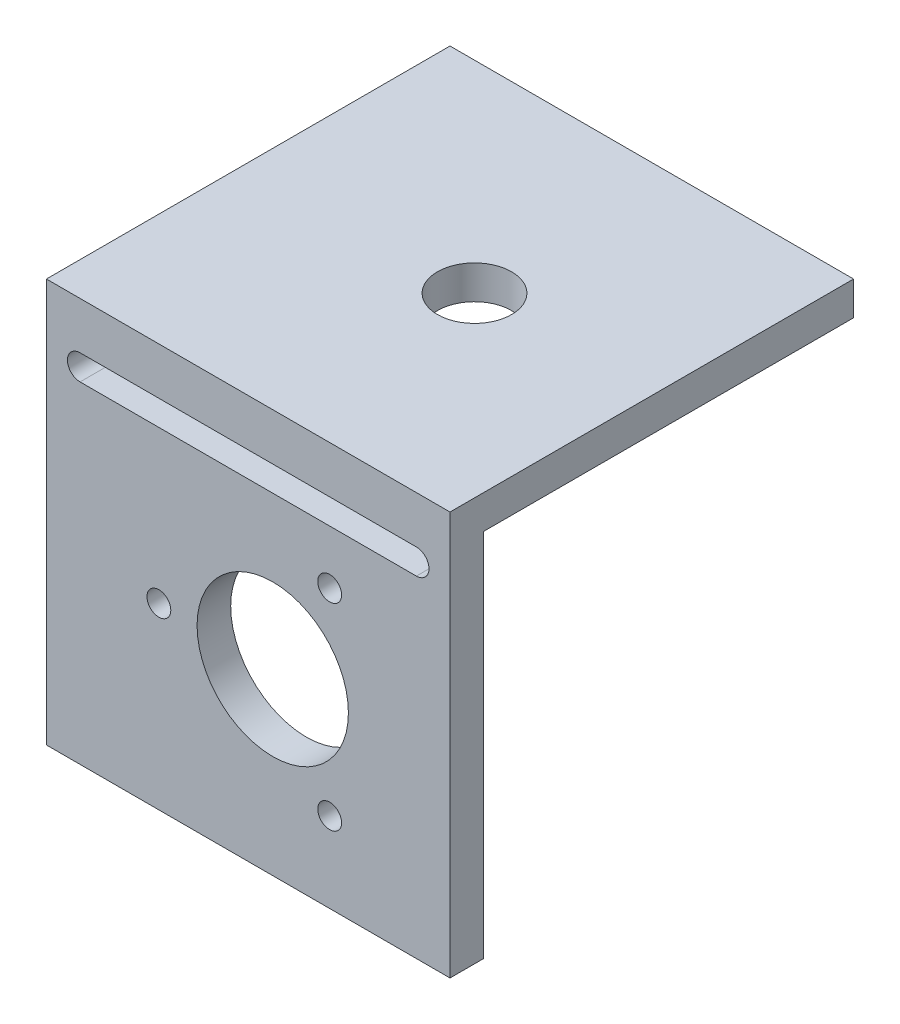
ISO-10303-21;
HEADER;
FILE_DESCRIPTION(('STEP AP214'),'2;1');
FILE_NAME('part.step','',(''),(''),'','','');
FILE_SCHEMA(('AUTOMOTIVE_DESIGN { 1 0 10303 214 1 1 1 1 }'));
ENDSEC;
DATA;
#1=APPLICATION_CONTEXT('core data for automotive mechanical design processes');
#2=APPLICATION_PROTOCOL_DEFINITION('international standard','automotive_design',2000,#1);
#3=PRODUCT_CONTEXT('',#1,'mechanical');
#4=PRODUCT('Part','Part','',(#3));
#5=PRODUCT_RELATED_PRODUCT_CATEGORY('part','',(#4));
#6=PRODUCT_DEFINITION_FORMATION('','',#4);
#7=PRODUCT_DEFINITION_CONTEXT('part definition',#1,'design');
#8=PRODUCT_DEFINITION('design','',#6,#7);
#9=PRODUCT_DEFINITION_SHAPE('','',#8);
#10=(LENGTH_UNIT() NAMED_UNIT(*) SI_UNIT(.MILLI.,.METRE.));
#11=(NAMED_UNIT(*) PLANE_ANGLE_UNIT() SI_UNIT($,.RADIAN.));
#12=(NAMED_UNIT(*) SI_UNIT($,.STERADIAN.) SOLID_ANGLE_UNIT());
#13=UNCERTAINTY_MEASURE_WITH_UNIT(LENGTH_MEASURE(1.E-05),#10,'distance_accuracy_value','');
#14=(GEOMETRIC_REPRESENTATION_CONTEXT(3) GLOBAL_UNCERTAINTY_ASSIGNED_CONTEXT((#13)) GLOBAL_UNIT_ASSIGNED_CONTEXT((#10,
#11,#12)) REPRESENTATION_CONTEXT('',''));
#15=CARTESIAN_POINT('',(0.,0.,0.));
#16=DIRECTION('',(0.,0.,1.));
#17=DIRECTION('',(1.,0.,0.));
#18=AXIS2_PLACEMENT_3D('',#15,#16,#17);
#19=CARTESIAN_POINT('',(76.2,0.,6.35));
#20=DIRECTION('',(0.,0.,-1.));
#21=DIRECTION('',(0.,1.,0.));
#22=AXIS2_PLACEMENT_3D('',#19,#20,#21);
#23=PLANE('',#22);
#24=DIRECTION('',(1.,0.,0.));
#25=VECTOR('',#24,1.);
#26=CARTESIAN_POINT('',(69.85,67.31,6.35));
#27=LINE('',#26,#25);
#28=CARTESIAN_POINT('',(6.35,67.31,6.35));
#29=VERTEX_POINT('',#28);
#30=CARTESIAN_POINT('',(69.85,67.31,6.35));
#31=VERTEX_POINT('',#30);
#32=EDGE_CURVE('E127',#29,#31,#27,.T.);
#33=ORIENTED_EDGE('',*,*,#32,.T.);
#34=CARTESIAN_POINT('',(69.85,64.92875,6.35));
#35=DIRECTION('',(0.,0.,-1.));
#36=DIRECTION('',(0.,1.,0.));
#37=AXIS2_PLACEMENT_3D('',#34,#35,#36);
#38=CIRCLE('',#37,2.38125);
#39=CARTESIAN_POINT('',(69.85,62.5475,6.35));
#40=VERTEX_POINT('',#39);
#41=EDGE_CURVE('E120',#31,#40,#38,.T.);
#42=ORIENTED_EDGE('',*,*,#41,.T.);
#43=DIRECTION('',(-1.,0.,0.));
#44=VECTOR('',#43,1.);
#45=CARTESIAN_POINT('',(69.85,62.5475,6.35));
#46=LINE('',#45,#44);
#47=CARTESIAN_POINT('',(6.35000000000001,62.5475,6.34999999999999));
#48=VERTEX_POINT('',#47);
#49=EDGE_CURVE('E130',#40,#48,#46,.T.);
#50=ORIENTED_EDGE('',*,*,#49,.T.);
#51=CARTESIAN_POINT('',(6.35,64.92875,6.35));
#52=DIRECTION('',(0.,0.,-1.));
#53=DIRECTION('',(0.,1.,0.));
#54=AXIS2_PLACEMENT_3D('',#51,#52,#53);
#55=CIRCLE('',#54,2.38125);
#56=EDGE_CURVE('E56',#48,#29,#55,.T.);
#57=ORIENTED_EDGE('',*,*,#56,.T.);
#58=EDGE_LOOP('',(#33,#42,#50,#57));
#59=FACE_BOUND('',#58,.T.);
#60=CARTESIAN_POINT('',(53.479606228,52.38154618137,6.35));
#61=DIRECTION('',(0.,0.,1.));
#62=DIRECTION('',(1.,0.,0.));
#63=AXIS2_PLACEMENT_3D('',#60,#61,#62);
#64=CIRCLE('',#63,2.25);
#65=CARTESIAN_POINT('',(55.729606228,52.38154618137,6.35));
#66=VERTEX_POINT('',#65);
#67=EDGE_CURVE('E173',#66,#66,#64,.T.);
#68=ORIENTED_EDGE('',*,*,#67,.F.);
#69=EDGE_LOOP('',(#68));
#70=FACE_BOUND('',#69,.T.);
#71=CARTESIAN_POINT('',(21.229606228,33.762,6.35));
#72=DIRECTION('',(0.,0.,1.));
#73=DIRECTION('',(1.,0.,0.));
#74=AXIS2_PLACEMENT_3D('',#71,#72,#73);
#75=CIRCLE('',#74,2.24999999999999);
#76=CARTESIAN_POINT('',(23.479606228,33.762,6.35));
#77=VERTEX_POINT('',#76);
#78=EDGE_CURVE('E177',#77,#77,#75,.T.);
#79=ORIENTED_EDGE('',*,*,#78,.F.);
#80=EDGE_LOOP('',(#79));
#81=FACE_BOUND('',#80,.T.);
#82=CARTESIAN_POINT('',(53.479606228,15.14245381863,6.35));
#83=DIRECTION('',(0.,0.,1.));
#84=DIRECTION('',(1.,0.,0.));
#85=AXIS2_PLACEMENT_3D('',#82,#83,#84);
#86=CIRCLE('',#85,2.25);
#87=CARTESIAN_POINT('',(55.729606228,15.14245381863,6.35));
#88=VERTEX_POINT('',#87);
#89=EDGE_CURVE('E182',#88,#88,#86,.T.);
#90=ORIENTED_EDGE('',*,*,#89,.F.);
#91=EDGE_LOOP('',(#90));
#92=FACE_BOUND('',#91,.T.);
#93=CARTESIAN_POINT('',(42.729606228,33.762,6.35));
#94=DIRECTION('',(0.,0.,1.));
#95=DIRECTION('',(1.,0.,0.));
#96=AXIS2_PLACEMENT_3D('',#93,#94,#95);
#97=CIRCLE('',#96,14.2875);
#98=CARTESIAN_POINT('',(57.017106228,33.762,6.34999999999999));
#99=VERTEX_POINT('',#98);
#100=EDGE_CURVE('E190',#99,#99,#97,.T.);
#101=ORIENTED_EDGE('',*,*,#100,.F.);
#102=EDGE_LOOP('',(#101));
#103=FACE_BOUND('',#102,.T.);
#104=DIRECTION('',(0.,-1.,0.));
#105=VECTOR('',#104,1.);
#106=CARTESIAN_POINT('',(0.,0.,6.35));
#107=LINE('',#106,#105);
#108=CARTESIAN_POINT('',(0.,76.2,6.34999999999999));
#109=VERTEX_POINT('',#108);
#110=CARTESIAN_POINT('',(0.,0.,6.35));
#111=VERTEX_POINT('',#110);
#112=EDGE_CURVE('E216',#109,#111,#107,.T.);
#113=ORIENTED_EDGE('',*,*,#112,.T.);
#114=DIRECTION('',(-1.,0.,0.));
#115=VECTOR('',#114,1.);
#116=CARTESIAN_POINT('',(76.2,0.,6.35));
#117=LINE('',#116,#115);
#118=CARTESIAN_POINT('',(76.2,0.,6.35));
#119=VERTEX_POINT('',#118);
#120=EDGE_CURVE('E11',#119,#111,#117,.T.);
#121=ORIENTED_EDGE('',*,*,#120,.F.);
#122=DIRECTION('',(0.,-1.,0.));
#123=VECTOR('',#122,1.);
#124=CARTESIAN_POINT('',(76.2,0.,6.35));
#125=LINE('',#124,#123);
#126=CARTESIAN_POINT('',(76.2,76.2,6.34999999999999));
#127=VERTEX_POINT('',#126);
#128=EDGE_CURVE('E195',#127,#119,#125,.T.);
#129=ORIENTED_EDGE('',*,*,#128,.F.);
#130=DIRECTION('',(-1.,0.,0.));
#131=VECTOR('',#130,1.);
#132=CARTESIAN_POINT('',(76.2,76.2,6.34999999999999));
#133=LINE('',#132,#131);
#134=EDGE_CURVE('E215',#127,#109,#133,.T.);
#135=ORIENTED_EDGE('',*,*,#134,.T.);
#136=EDGE_LOOP('',(#113,#121,#129,#135));
#137=FACE_BOUND('',#136,.T.);
#138=ADVANCED_FACE('F39',(#59,#70,#81,#92,#103,#137),#23,.F.);
#139=CARTESIAN_POINT('',(76.2,0.,0.));
#140=DIRECTION('',(0.,1.,0.));
#141=DIRECTION('',(0.,0.,1.));
#142=AXIS2_PLACEMENT_3D('',#139,#140,#141);
#143=PLANE('',#142);
#144=DIRECTION('',(0.,0.,-1.));
#145=VECTOR('',#144,1.);
#146=CARTESIAN_POINT('',(0.,0.,0.));
#147=LINE('',#146,#145);
#148=CARTESIAN_POINT('',(0.,0.,0.));
#149=VERTEX_POINT('',#148);
#150=EDGE_CURVE('E220',#111,#149,#147,.T.);
#151=ORIENTED_EDGE('',*,*,#150,.T.);
#152=DIRECTION('',(-1.,0.,0.));
#153=VECTOR('',#152,1.);
#154=CARTESIAN_POINT('',(76.2,0.,0.));
#155=LINE('',#154,#153);
#156=CARTESIAN_POINT('',(76.2,0.,0.));
#157=VERTEX_POINT('',#156);
#158=EDGE_CURVE('E48',#157,#149,#155,.T.);
#159=ORIENTED_EDGE('',*,*,#158,.F.);
#160=DIRECTION('',(0.,0.,-1.));
#161=VECTOR('',#160,1.);
#162=CARTESIAN_POINT('',(76.2,0.,0.));
#163=LINE('',#162,#161);
#164=EDGE_CURVE('E199',#119,#157,#163,.T.);
#165=ORIENTED_EDGE('',*,*,#164,.F.);
#166=ORIENTED_EDGE('',*,*,#120,.T.);
#167=EDGE_LOOP('',(#151,#159,#165,#166));
#168=FACE_BOUND('',#167,.T.);
#169=ADVANCED_FACE('F278',(#168),#143,.F.);
#170=CARTESIAN_POINT('',(76.2,69.85,0.));
#171=DIRECTION('',(0.,0.,1.));
#172=DIRECTION('',(0.,-1.,0.));
#173=AXIS2_PLACEMENT_3D('',#170,#171,#172);
#174=PLANE('',#173);
#175=DIRECTION('',(-1.,0.,0.));
#176=VECTOR('',#175,1.);
#177=CARTESIAN_POINT('',(69.85,62.5475,0.));
#178=LINE('',#177,#176);
#179=CARTESIAN_POINT('',(69.85,62.5475,0.));
#180=VERTEX_POINT('',#179);
#181=CARTESIAN_POINT('',(6.35,62.5475,0.));
#182=VERTEX_POINT('',#181);
#183=EDGE_CURVE('E151',#180,#182,#178,.T.);
#184=ORIENTED_EDGE('',*,*,#183,.F.);
#185=CARTESIAN_POINT('',(69.85,64.92875,0.));
#186=DIRECTION('',(0.,0.,-1.));
#187=DIRECTION('',(0.,1.,0.));
#188=AXIS2_PLACEMENT_3D('',#185,#186,#187);
#189=CIRCLE('',#188,2.38125);
#190=CARTESIAN_POINT('',(69.85,67.31,0.));
#191=VERTEX_POINT('',#190);
#192=EDGE_CURVE('E64',#191,#180,#189,.T.);
#193=ORIENTED_EDGE('',*,*,#192,.F.);
#194=DIRECTION('',(1.,0.,0.));
#195=VECTOR('',#194,1.);
#196=CARTESIAN_POINT('',(69.85,67.31,0.));
#197=LINE('',#196,#195);
#198=CARTESIAN_POINT('',(6.35,67.31,0.));
#199=VERTEX_POINT('',#198);
#200=EDGE_CURVE('E138',#199,#191,#197,.T.);
#201=ORIENTED_EDGE('',*,*,#200,.F.);
#202=CARTESIAN_POINT('',(6.35,64.92875,0.));
#203=DIRECTION('',(0.,0.,-1.));
#204=DIRECTION('',(0.,1.,0.));
#205=AXIS2_PLACEMENT_3D('',#202,#203,#204);
#206=CIRCLE('',#205,2.38125);
#207=EDGE_CURVE('E142',#182,#199,#206,.T.);
#208=ORIENTED_EDGE('',*,*,#207,.F.);
#209=EDGE_LOOP('',(#184,#193,#201,#208));
#210=FACE_BOUND('',#209,.T.);
#211=CARTESIAN_POINT('',(53.479606228,52.38154618137,0.));
#212=DIRECTION('',(0.,0.,1.));
#213=DIRECTION('',(0.,-1.,0.));
#214=AXIS2_PLACEMENT_3D('',#211,#212,#213);
#215=CIRCLE('',#214,2.24999999999999);
#216=CARTESIAN_POINT('',(53.479606228,50.13154618137,0.));
#217=VERTEX_POINT('',#216);
#218=EDGE_CURVE('E42',#217,#217,#215,.T.);
#219=ORIENTED_EDGE('',*,*,#218,.T.);
#220=EDGE_LOOP('',(#219));
#221=FACE_BOUND('',#220,.T.);
#222=CARTESIAN_POINT('',(21.229606228,33.762,0.));
#223=DIRECTION('',(0.,0.,1.));
#224=DIRECTION('',(0.,-1.,0.));
#225=AXIS2_PLACEMENT_3D('',#222,#223,#224);
#226=CIRCLE('',#225,2.24999999999999);
#227=CARTESIAN_POINT('',(21.229606228,31.512,0.));
#228=VERTEX_POINT('',#227);
#229=EDGE_CURVE('E181',#228,#228,#226,.T.);
#230=ORIENTED_EDGE('',*,*,#229,.T.);
#231=EDGE_LOOP('',(#230));
#232=FACE_BOUND('',#231,.T.);
#233=CARTESIAN_POINT('',(53.479606228,15.14245381863,0.));
#234=DIRECTION('',(0.,0.,1.));
#235=DIRECTION('',(0.,-1.,0.));
#236=AXIS2_PLACEMENT_3D('',#233,#234,#235);
#237=CIRCLE('',#236,2.24999999999999);
#238=CARTESIAN_POINT('',(53.479606228,12.89245381863,0.));
#239=VERTEX_POINT('',#238);
#240=EDGE_CURVE('E186',#239,#239,#237,.T.);
#241=ORIENTED_EDGE('',*,*,#240,.T.);
#242=EDGE_LOOP('',(#241));
#243=FACE_BOUND('',#242,.T.);
#244=CARTESIAN_POINT('',(42.729606228,33.762,0.));
#245=DIRECTION('',(0.,0.,1.));
#246=DIRECTION('',(0.,-1.,0.));
#247=AXIS2_PLACEMENT_3D('',#244,#245,#246);
#248=CIRCLE('',#247,14.2875);
#249=CARTESIAN_POINT('',(57.017106228,33.762,0.));
#250=VERTEX_POINT('',#249);
#251=EDGE_CURVE('E194',#250,#250,#248,.T.);
#252=ORIENTED_EDGE('',*,*,#251,.T.);
#253=EDGE_LOOP('',(#252));
#254=FACE_BOUND('',#253,.T.);
#255=DIRECTION('',(0.,1.,0.));
#256=VECTOR('',#255,1.);
#257=CARTESIAN_POINT('',(0.,69.85,0.));
#258=LINE('',#257,#256);
#259=CARTESIAN_POINT('',(0.,69.85,0.));
#260=VERTEX_POINT('',#259);
#261=EDGE_CURVE('E223',#149,#260,#258,.T.);
#262=ORIENTED_EDGE('',*,*,#261,.T.);
#263=DIRECTION('',(-1.,0.,0.));
#264=VECTOR('',#263,1.);
#265=CARTESIAN_POINT('',(76.2,69.85,0.));
#266=LINE('',#265,#264);
#267=CARTESIAN_POINT('',(76.2,69.85,0.));
#268=VERTEX_POINT('',#267);
#269=EDGE_CURVE('E245',#268,#260,#266,.T.);
#270=ORIENTED_EDGE('',*,*,#269,.F.);
#271=DIRECTION('',(0.,1.,0.));
#272=VECTOR('',#271,1.);
#273=CARTESIAN_POINT('',(76.2,69.85,0.));
#274=LINE('',#273,#272);
#275=EDGE_CURVE('E203',#157,#268,#274,.T.);
#276=ORIENTED_EDGE('',*,*,#275,.F.);
#277=ORIENTED_EDGE('',*,*,#158,.T.);
#278=EDGE_LOOP('',(#262,#270,#276,#277));
#279=FACE_BOUND('',#278,.T.);
#280=ADVANCED_FACE('F258',(#210,#221,#232,#243,#254,#279),#174,.F.);
#281=CARTESIAN_POINT('',(76.2,69.85,-69.85));
#282=DIRECTION('',(0.,1.,0.));
#283=DIRECTION('',(0.,0.,1.));
#284=AXIS2_PLACEMENT_3D('',#281,#282,#283);
#285=PLANE('',#284);
#286=CARTESIAN_POINT('',(42.7296144138098,69.85,-31.7500000000001));
#287=DIRECTION('',(0.,1.,0.));
#288=DIRECTION('',(0.,0.,1.));
#289=AXIS2_PLACEMENT_3D('',#286,#287,#288);
#290=CIRCLE('',#289,6.99999999999847);
#291=CARTESIAN_POINT('',(42.7296144138098,69.85,-24.7500000000017));
#292=VERTEX_POINT('',#291);
#293=EDGE_CURVE('E169',#292,#292,#290,.F.);
#294=ORIENTED_EDGE('',*,*,#293,.F.);
#295=EDGE_LOOP('',(#294));
#296=FACE_BOUND('',#295,.T.);
#297=DIRECTION('',(0.,0.,-1.));
#298=VECTOR('',#297,1.);
#299=CARTESIAN_POINT('',(0.,69.85,-69.85));
#300=LINE('',#299,#298);
#301=CARTESIAN_POINT('',(0.,69.85,-69.85));
#302=VERTEX_POINT('',#301);
#303=EDGE_CURVE('E226',#260,#302,#300,.T.);
#304=ORIENTED_EDGE('',*,*,#303,.T.);
#305=DIRECTION('',(-1.,0.,0.));
#306=VECTOR('',#305,1.);
#307=CARTESIAN_POINT('',(76.2,69.85,-69.85));
#308=LINE('',#307,#306);
#309=CARTESIAN_POINT('',(76.2,69.85,-69.85));
#310=VERTEX_POINT('',#309);
#311=EDGE_CURVE('E241',#310,#302,#308,.T.);
#312=ORIENTED_EDGE('',*,*,#311,.F.);
#313=DIRECTION('',(0.,0.,-1.));
#314=VECTOR('',#313,1.);
#315=CARTESIAN_POINT('',(76.2,69.85,-69.85));
#316=LINE('',#315,#314);
#317=EDGE_CURVE('E206',#268,#310,#316,.T.);
#318=ORIENTED_EDGE('',*,*,#317,.F.);
#319=ORIENTED_EDGE('',*,*,#269,.T.);
#320=EDGE_LOOP('',(#304,#312,#318,#319));
#321=FACE_BOUND('',#320,.T.);
#322=ADVANCED_FACE('F286',(#296,#321),#285,.F.);
#323=CARTESIAN_POINT('',(76.2,76.2,-69.85));
#324=DIRECTION('',(0.,0.,1.));
#325=DIRECTION('',(0.,-1.,0.));
#326=AXIS2_PLACEMENT_3D('',#323,#324,#325);
#327=PLANE('',#326);
#328=DIRECTION('',(0.,1.,0.));
#329=VECTOR('',#328,1.);
#330=CARTESIAN_POINT('',(0.,76.2,-69.85));
#331=LINE('',#330,#329);
#332=CARTESIAN_POINT('',(0.,76.2,-69.85));
#333=VERTEX_POINT('',#332);
#334=EDGE_CURVE('E229',#302,#333,#331,.T.);
#335=ORIENTED_EDGE('',*,*,#334,.T.);
#336=DIRECTION('',(-1.,0.,0.));
#337=VECTOR('',#336,1.);
#338=CARTESIAN_POINT('',(76.2,76.2,-69.85));
#339=LINE('',#338,#337);
#340=CARTESIAN_POINT('',(76.2,76.2,-69.85));
#341=VERTEX_POINT('',#340);
#342=EDGE_CURVE('E237',#341,#333,#339,.T.);
#343=ORIENTED_EDGE('',*,*,#342,.F.);
#344=DIRECTION('',(0.,1.,0.));
#345=VECTOR('',#344,1.);
#346=CARTESIAN_POINT('',(76.2,76.2,-69.85));
#347=LINE('',#346,#345);
#348=EDGE_CURVE('E209',#310,#341,#347,.T.);
#349=ORIENTED_EDGE('',*,*,#348,.F.);
#350=ORIENTED_EDGE('',*,*,#311,.T.);
#351=EDGE_LOOP('',(#335,#343,#349,#350));
#352=FACE_BOUND('',#351,.T.);
#353=ADVANCED_FACE('F292',(#352),#327,.F.);
#354=CARTESIAN_POINT('',(76.2,76.2,6.34999999999999));
#355=DIRECTION('',(0.,-1.,0.));
#356=DIRECTION('',(0.,0.,-1.));
#357=AXIS2_PLACEMENT_3D('',#354,#355,#356);
#358=PLANE('',#357);
#359=CARTESIAN_POINT('',(42.7296144138098,76.2,-31.7500000000001));
#360=DIRECTION('',(0.,1.,0.));
#361=DIRECTION('',(0.,0.,1.));
#362=AXIS2_PLACEMENT_3D('',#359,#360,#361);
#363=CIRCLE('',#362,6.99999999999847);
#364=CARTESIAN_POINT('',(42.7296144138098,76.2,-24.7500000000017));
#365=VERTEX_POINT('',#364);
#366=EDGE_CURVE('E160',#365,#365,#363,.T.);
#367=ORIENTED_EDGE('',*,*,#366,.F.);
#368=EDGE_LOOP('',(#367));
#369=FACE_BOUND('',#368,.T.);
#370=DIRECTION('',(0.,0.,1.));
#371=VECTOR('',#370,1.);
#372=CARTESIAN_POINT('',(0.,76.2,6.34999999999999));
#373=LINE('',#372,#371);
#374=EDGE_CURVE('E200',#333,#109,#373,.T.);
#375=ORIENTED_EDGE('',*,*,#374,.T.);
#376=ORIENTED_EDGE('',*,*,#134,.F.);
#377=DIRECTION('',(0.,0.,1.));
#378=VECTOR('',#377,1.);
#379=CARTESIAN_POINT('',(76.2,76.2,6.34999999999999));
#380=LINE('',#379,#378);
#381=EDGE_CURVE('E212',#341,#127,#380,.T.);
#382=ORIENTED_EDGE('',*,*,#381,.F.);
#383=ORIENTED_EDGE('',*,*,#342,.T.);
#384=EDGE_LOOP('',(#375,#376,#382,#383));
#385=FACE_BOUND('',#384,.T.);
#386=ADVANCED_FACE('F296',(#369,#385),#358,.F.);
#387=CARTESIAN_POINT('',(76.2,0.,0.));
#388=DIRECTION('',(-1.,0.,0.));
#389=DIRECTION('',(0.,0.,1.));
#390=AXIS2_PLACEMENT_3D('',#387,#388,#389);
#391=PLANE('',#390);
#392=ORIENTED_EDGE('',*,*,#128,.T.);
#393=ORIENTED_EDGE('',*,*,#164,.T.);
#394=ORIENTED_EDGE('',*,*,#275,.T.);
#395=ORIENTED_EDGE('',*,*,#317,.T.);
#396=ORIENTED_EDGE('',*,*,#348,.T.);
#397=ORIENTED_EDGE('',*,*,#381,.T.);
#398=EDGE_LOOP('',(#392,#393,#394,#395,#396,#397));
#399=FACE_BOUND('',#398,.T.);
#400=ADVANCED_FACE('F300',(#399),#391,.F.);
#401=CARTESIAN_POINT('',(0.,0.,0.));
#402=DIRECTION('',(-1.,0.,0.));
#403=DIRECTION('',(0.,0.,1.));
#404=AXIS2_PLACEMENT_3D('',#401,#402,#403);
#405=PLANE('',#404);
#406=ORIENTED_EDGE('',*,*,#112,.F.);
#407=ORIENTED_EDGE('',*,*,#374,.F.);
#408=ORIENTED_EDGE('',*,*,#334,.F.);
#409=ORIENTED_EDGE('',*,*,#303,.F.);
#410=ORIENTED_EDGE('',*,*,#261,.F.);
#411=ORIENTED_EDGE('',*,*,#150,.F.);
#412=EDGE_LOOP('',(#406,#407,#408,#409,#410,#411));
#413=FACE_BOUND('',#412,.T.);
#414=ADVANCED_FACE('F302',(#413),#405,.T.);
#415=CARTESIAN_POINT('',(42.729606228,33.762,-69.85));
#416=DIRECTION('',(0.,0.,1.));
#417=DIRECTION('',(1.,0.,0.));
#418=AXIS2_PLACEMENT_3D('',#415,#416,#417);
#419=CYLINDRICAL_SURFACE('',#418,14.2875);
#420=CARTESIAN_POINT('',(57.017106228,33.762,6.34999999999999));
#421=CARTESIAN_POINT('',(57.017106228,33.762,6.28385416666666));
#422=CARTESIAN_POINT('',(57.017106228,33.762,6.21770833333333));
#423=CARTESIAN_POINT('',(57.017106228,33.762,6.08541666666666));
#424=CARTESIAN_POINT('',(57.017106228,33.762,6.01927083333333));
#425=CARTESIAN_POINT('',(57.017106228,33.762,5.88697916666666));
#426=CARTESIAN_POINT('',(57.017106228,33.762,5.82083333333333));
#427=CARTESIAN_POINT('',(57.017106228,33.762,5.68854166666666));
#428=CARTESIAN_POINT('',(57.017106228,33.762,5.62239583333332));
#429=CARTESIAN_POINT('',(57.017106228,33.762,5.49010416666665));
#430=CARTESIAN_POINT('',(57.017106228,33.762,5.42395833333332));
#431=CARTESIAN_POINT('',(57.017106228,33.762,5.29166666666666));
#432=CARTESIAN_POINT('',(57.017106228,33.762,5.22552083333333));
#433=CARTESIAN_POINT('',(57.017106228,33.762,5.09322916666666));
#434=CARTESIAN_POINT('',(57.017106228,33.762,5.02708333333332));
#435=CARTESIAN_POINT('',(57.017106228,33.762,4.89479166666665));
#436=CARTESIAN_POINT('',(57.017106228,33.762,4.82864583333332));
#437=CARTESIAN_POINT('',(57.017106228,33.762,4.69635416666666));
#438=CARTESIAN_POINT('',(57.017106228,33.762,4.63020833333333));
#439=CARTESIAN_POINT('',(57.017106228,33.762,4.49791666666666));
#440=CARTESIAN_POINT('',(57.017106228,33.762,4.43177083333332));
#441=CARTESIAN_POINT('',(57.017106228,33.762,4.29947916666665));
#442=CARTESIAN_POINT('',(57.017106228,33.762,4.23333333333332));
#443=CARTESIAN_POINT('',(57.017106228,33.762,4.10104166666666));
#444=CARTESIAN_POINT('',(57.017106228,33.762,4.03489583333333));
#445=CARTESIAN_POINT('',(57.017106228,33.762,3.90260416666666));
#446=CARTESIAN_POINT('',(57.017106228,33.762,3.83645833333332));
#447=CARTESIAN_POINT('',(57.017106228,33.762,3.70416666666665));
#448=CARTESIAN_POINT('',(57.017106228,33.762,3.63802083333332));
#449=CARTESIAN_POINT('',(57.017106228,33.762,3.50572916666665));
#450=CARTESIAN_POINT('',(57.017106228,33.762,3.43958333333332));
#451=CARTESIAN_POINT('',(57.017106228,33.762,3.30729166666665));
#452=CARTESIAN_POINT('',(57.017106228,33.762,3.24114583333332));
#453=CARTESIAN_POINT('',(57.017106228,33.762,3.10885416666665));
#454=CARTESIAN_POINT('',(57.017106228,33.762,3.04270833333332));
#455=CARTESIAN_POINT('',(57.017106228,33.762,2.91041666666665));
#456=CARTESIAN_POINT('',(57.017106228,33.762,2.84427083333332));
#457=CARTESIAN_POINT('',(57.017106228,33.762,2.71197916666665));
#458=CARTESIAN_POINT('',(57.017106228,33.762,2.64583333333331));
#459=CARTESIAN_POINT('',(57.017106228,33.762,2.51354166666665));
#460=CARTESIAN_POINT('',(57.017106228,33.762,2.44739583333331));
#461=CARTESIAN_POINT('',(57.017106228,33.762,2.31510416666664));
#462=CARTESIAN_POINT('',(57.017106228,33.762,2.24895833333331));
#463=CARTESIAN_POINT('',(57.017106228,33.762,2.11666666666665));
#464=CARTESIAN_POINT('',(57.017106228,33.762,2.05052083333331));
#465=CARTESIAN_POINT('',(57.017106228,33.762,1.91822916666665));
#466=CARTESIAN_POINT('',(57.017106228,33.762,1.85208333333331));
#467=CARTESIAN_POINT('',(57.017106228,33.762,1.71979166666664));
#468=CARTESIAN_POINT('',(57.017106228,33.762,1.65364583333331));
#469=CARTESIAN_POINT('',(57.017106228,33.762,1.52135416666665));
#470=CARTESIAN_POINT('',(57.017106228,33.762,1.45520833333331));
#471=CARTESIAN_POINT('',(57.017106228,33.762,1.32291666666665));
#472=CARTESIAN_POINT('',(57.017106228,33.762,1.25677083333331));
#473=CARTESIAN_POINT('',(57.017106228,33.762,1.12447916666664));
#474=CARTESIAN_POINT('',(57.017106228,33.762,1.05833333333331));
#475=CARTESIAN_POINT('',(57.017106228,33.762,0.926041666666646));
#476=CARTESIAN_POINT('',(57.017106228,33.762,0.859895833333314));
#477=CARTESIAN_POINT('',(57.017106228,33.762,0.727604166666646));
#478=CARTESIAN_POINT('',(57.017106228,33.762,0.661458333333309));
#479=CARTESIAN_POINT('',(57.017106228,33.762,0.529166666666641));
#480=CARTESIAN_POINT('',(57.017106228,33.762,0.463020833333309));
#481=CARTESIAN_POINT('',(57.017106228,33.762,0.330729166666641));
#482=CARTESIAN_POINT('',(57.017106228,33.762,0.264583333333304));
#483=CARTESIAN_POINT('',(57.017106228,33.762,0.132291666666636));
#484=CARTESIAN_POINT('',(57.017106228,33.762,0.0661458333333041));
#485=CARTESIAN_POINT('',(57.017106228,33.762,0.));
#486=B_SPLINE_CURVE_WITH_KNOTS('',3,(#420,#421,#422,#423,#424,#425,#426,#427,#428,#429,#430,
#431,#432,#433,#434,#435,#436,#437,#438,#439,#440,#441,#442,#443,#444,#445,#446,#447,#448,#449,
#450,#451,#452,#453,#454,#455,#456,#457,#458,#459,#460,#461,#462,#463,#464,#465,#466,#467,#468,
#469,#470,#471,#472,#473,#474,#475,#476,#477,#478,#479,#480,#481,#482,#483,#484,#485),
.UNSPECIFIED.,.F.,.F.,(4,2,2,2,2,2,2,2,2,2,2,2,2,2,2,2,2,2,2,2,2,2,2,2,2,2,2,2,2,2,2,2,4),(0.,
0.198437499999995,0.396875000000005,0.5953125,0.79375000000001,0.992187500000005,1.190625,
1.38906250000001,1.58750000000001,1.7859375,1.98437500000001,2.18281250000001,2.38125,
2.57968750000001,2.77812500000001,2.97656250000002,3.17500000000001,3.37343750000001,
3.57187500000002,3.77031250000001,3.96875000000002,4.16718750000002,4.36562500000001,
4.56406250000002,4.76250000000002,4.96093750000001,5.15937500000002,5.35781250000002,
5.55625000000001,5.75468750000002,5.95312500000002,6.15156250000003,6.35000000000002),.UNSPECIFIED.);
#487=EDGE_CURVE('BSEAM274',#99,#250,#486,.T.);
#488=ORIENTED_EDGE('',*,*,#100,.T.);
#489=ORIENTED_EDGE('',*,*,#251,.F.);
#490=ORIENTED_EDGE('',*,*,#487,.T.);
#491=ORIENTED_EDGE('',*,*,#487,.F.);
#492=EDGE_LOOP('',(#488,#490,#489,#491));
#493=FACE_BOUND('',#492,.T.);
#494=ADVANCED_FACE('F274',(#493),#419,.F.);
#495=CARTESIAN_POINT('',(53.479606228,15.14245381863,6.35));
#496=DIRECTION('',(0.,0.,1.));
#497=DIRECTION('',(1.,0.,0.));
#498=AXIS2_PLACEMENT_3D('',#495,#496,#497);
#499=CYLINDRICAL_SURFACE('',#498,2.24999999999999);
#500=ORIENTED_EDGE('',*,*,#89,.T.);
#501=EDGE_LOOP('',(#500));
#502=FACE_BOUND('',#501,.T.);
#503=ORIENTED_EDGE('',*,*,#240,.F.);
#504=EDGE_LOOP('',(#503));
#505=FACE_BOUND('',#504,.T.);
#506=ADVANCED_FACE('F264',(#502,#505),#499,.F.);
#507=CARTESIAN_POINT('',(21.229606228,33.762,6.35));
#508=DIRECTION('',(0.,0.,1.));
#509=DIRECTION('',(1.,0.,0.));
#510=AXIS2_PLACEMENT_3D('',#507,#508,#509);
#511=CYLINDRICAL_SURFACE('',#510,2.24999999999999);
#512=ORIENTED_EDGE('',*,*,#78,.T.);
#513=EDGE_LOOP('',(#512));
#514=FACE_BOUND('',#513,.T.);
#515=ORIENTED_EDGE('',*,*,#229,.F.);
#516=EDGE_LOOP('',(#515));
#517=FACE_BOUND('',#516,.T.);
#518=ADVANCED_FACE('F261',(#514,#517),#511,.F.);
#519=CARTESIAN_POINT('',(53.479606228,52.38154618137,6.35));
#520=DIRECTION('',(0.,0.,1.));
#521=DIRECTION('',(1.,0.,0.));
#522=AXIS2_PLACEMENT_3D('',#519,#520,#521);
#523=CYLINDRICAL_SURFACE('',#522,2.24999999999999);
#524=ORIENTED_EDGE('',*,*,#67,.T.);
#525=EDGE_LOOP('',(#524));
#526=FACE_BOUND('',#525,.T.);
#527=ORIENTED_EDGE('',*,*,#218,.F.);
#528=EDGE_LOOP('',(#527));
#529=FACE_BOUND('',#528,.T.);
#530=ADVANCED_FACE('F263',(#526,#529),#523,.F.);
#531=CARTESIAN_POINT('',(42.7296144138098,-0.001000000000001,-31.7500000000001));
#532=DIRECTION('',(0.,1.,0.));
#533=DIRECTION('',(0.,0.,1.));
#534=AXIS2_PLACEMENT_3D('',#531,#532,#533);
#535=CYLINDRICAL_SURFACE('',#534,6.99999999999847);
#536=ORIENTED_EDGE('',*,*,#366,.T.);
#537=EDGE_LOOP('',(#536));
#538=FACE_BOUND('',#537,.T.);
#539=ORIENTED_EDGE('',*,*,#293,.T.);
#540=EDGE_LOOP('',(#539));
#541=FACE_BOUND('',#540,.T.);
#542=ADVANCED_FACE('F271',(#538,#541),#535,.F.);
#543=CARTESIAN_POINT('',(69.85,64.92875,6.35));
#544=DIRECTION('',(0.,0.,-1.));
#545=DIRECTION('',(0.,1.,0.));
#546=AXIS2_PLACEMENT_3D('',#543,#544,#545);
#547=CYLINDRICAL_SURFACE('',#546,2.38125);
#548=ORIENTED_EDGE('',*,*,#192,.T.);
#549=DIRECTION('',(0.,0.,-1.));
#550=VECTOR('',#549,1.);
#551=CARTESIAN_POINT('',(69.85,62.5475,6.35));
#552=LINE('',#551,#550);
#553=EDGE_CURVE('E116',#40,#180,#552,.T.);
#554=ORIENTED_EDGE('',*,*,#553,.F.);
#555=ORIENTED_EDGE('',*,*,#41,.F.);
#556=DIRECTION('',(0.,0.,-1.));
#557=VECTOR('',#556,1.);
#558=CARTESIAN_POINT('',(69.85,67.31,6.35));
#559=LINE('',#558,#557);
#560=EDGE_CURVE('E157',#31,#191,#559,.T.);
#561=ORIENTED_EDGE('',*,*,#560,.T.);
#562=EDGE_LOOP('',(#548,#554,#555,#561));
#563=FACE_BOUND('',#562,.T.);
#564=ADVANCED_FACE('F118',(#563),#547,.F.);
#565=CARTESIAN_POINT('',(69.85,67.31,6.35));
#566=DIRECTION('',(0.,1.,0.));
#567=DIRECTION('',(0.,0.,1.));
#568=AXIS2_PLACEMENT_3D('',#565,#566,#567);
#569=PLANE('',#568);
#570=ORIENTED_EDGE('',*,*,#200,.T.);
#571=ORIENTED_EDGE('',*,*,#560,.F.);
#572=ORIENTED_EDGE('',*,*,#32,.F.);
#573=DIRECTION('',(0.,0.,-1.));
#574=VECTOR('',#573,1.);
#575=CARTESIAN_POINT('',(6.35,67.31,6.35));
#576=LINE('',#575,#574);
#577=EDGE_CURVE('E161',#29,#199,#576,.T.);
#578=ORIENTED_EDGE('',*,*,#577,.T.);
#579=EDGE_LOOP('',(#570,#571,#572,#578));
#580=FACE_BOUND('',#579,.T.);
#581=ADVANCED_FACE('F397',(#580),#569,.F.);
#582=CARTESIAN_POINT('',(6.35,64.92875,6.35));
#583=DIRECTION('',(0.,0.,-1.));
#584=DIRECTION('',(0.,1.,0.));
#585=AXIS2_PLACEMENT_3D('',#582,#583,#584);
#586=CYLINDRICAL_SURFACE('',#585,2.38125);
#587=ORIENTED_EDGE('',*,*,#207,.T.);
#588=ORIENTED_EDGE('',*,*,#577,.F.);
#589=ORIENTED_EDGE('',*,*,#56,.F.);
#590=DIRECTION('',(0.,0.,-1.));
#591=VECTOR('',#590,1.);
#592=CARTESIAN_POINT('',(6.35,62.5475,6.35));
#593=LINE('',#592,#591);
#594=EDGE_CURVE('E126',#48,#182,#593,.T.);
#595=ORIENTED_EDGE('',*,*,#594,.T.);
#596=EDGE_LOOP('',(#587,#588,#589,#595));
#597=FACE_BOUND('',#596,.T.);
#598=ADVANCED_FACE('F406',(#597),#586,.F.);
#599=CARTESIAN_POINT('',(69.85,62.5475,6.35));
#600=DIRECTION('',(0.,-1.,0.));
#601=DIRECTION('',(0.,0.,-1.));
#602=AXIS2_PLACEMENT_3D('',#599,#600,#601);
#603=PLANE('',#602);
#604=ORIENTED_EDGE('',*,*,#183,.T.);
#605=ORIENTED_EDGE('',*,*,#594,.F.);
#606=ORIENTED_EDGE('',*,*,#49,.F.);
#607=ORIENTED_EDGE('',*,*,#553,.T.);
#608=EDGE_LOOP('',(#604,#605,#606,#607));
#609=FACE_BOUND('',#608,.T.);
#610=ADVANCED_FACE('F131',(#609),#603,.F.);
#611=CLOSED_SHELL('',(#138,#169,#280,#322,#353,#386,#400,#414,#494,#506,#518,#530,#542,#564,
#581,#598,#610));
#612=MANIFOLD_SOLID_BREP('B2',#611);
#613=ADVANCED_BREP_SHAPE_REPRESENTATION('',(#18,#612),#14);
#614=SHAPE_DEFINITION_REPRESENTATION(#9,#613);
ENDSEC;
END-ISO-10303-21;
